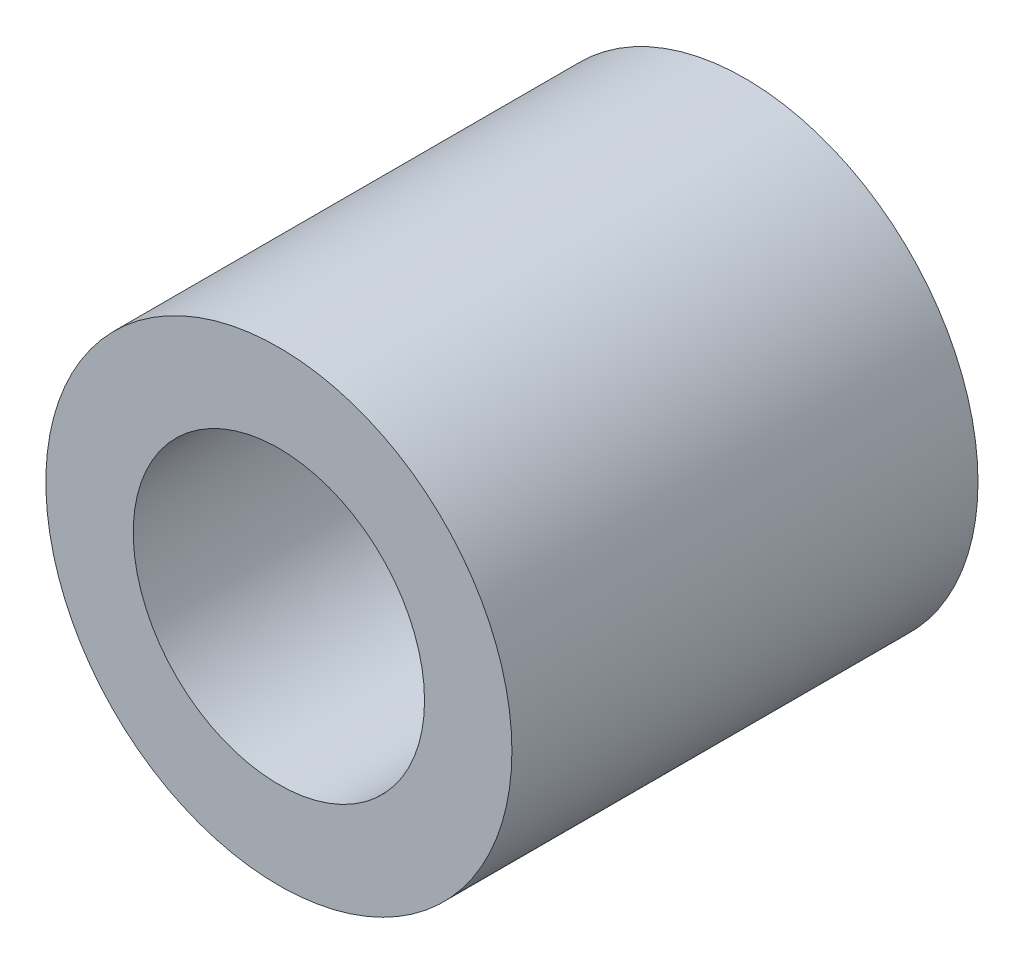
ISO-10303-21;
HEADER;
FILE_DESCRIPTION(('STEP AP214'),'2;1');
FILE_NAME('part.step','',(''),(''),'','','');
FILE_SCHEMA(('AUTOMOTIVE_DESIGN { 1 0 10303 214 1 1 1 1 }'));
ENDSEC;
DATA;
#1=APPLICATION_CONTEXT('core data for automotive mechanical design processes');
#2=APPLICATION_PROTOCOL_DEFINITION('international standard','automotive_design',2000,#1);
#3=PRODUCT_CONTEXT('',#1,'mechanical');
#4=PRODUCT('Part','Part','',(#3));
#5=PRODUCT_RELATED_PRODUCT_CATEGORY('part','',(#4));
#6=PRODUCT_DEFINITION_FORMATION('','',#4);
#7=PRODUCT_DEFINITION_CONTEXT('part definition',#1,'design');
#8=PRODUCT_DEFINITION('design','',#6,#7);
#9=PRODUCT_DEFINITION_SHAPE('','',#8);
#10=(LENGTH_UNIT() NAMED_UNIT(*) SI_UNIT(.MILLI.,.METRE.));
#11=(NAMED_UNIT(*) PLANE_ANGLE_UNIT() SI_UNIT($,.RADIAN.));
#12=(NAMED_UNIT(*) SI_UNIT($,.STERADIAN.) SOLID_ANGLE_UNIT());
#13=UNCERTAINTY_MEASURE_WITH_UNIT(LENGTH_MEASURE(1.E-05),#10,'distance_accuracy_value','');
#14=(GEOMETRIC_REPRESENTATION_CONTEXT(3) GLOBAL_UNCERTAINTY_ASSIGNED_CONTEXT((#13)) GLOBAL_UNIT_ASSIGNED_CONTEXT((#10,
#11,#12)) REPRESENTATION_CONTEXT('',''));
#15=CARTESIAN_POINT('',(0.,0.,0.));
#16=DIRECTION('',(0.,0.,1.));
#17=DIRECTION('',(1.,0.,0.));
#18=AXIS2_PLACEMENT_3D('',#15,#16,#17);
#19=CARTESIAN_POINT('',(0.,0.,8.));
#20=DIRECTION('',(0.,0.,-1.));
#21=DIRECTION('',(-1.,0.,0.));
#22=AXIS2_PLACEMENT_3D('',#19,#20,#21);
#23=CYLINDRICAL_SURFACE('',#22,5.);
#24=CARTESIAN_POINT('',(0.,0.,8.));
#25=DIRECTION('',(0.,0.,1.));
#26=DIRECTION('',(1.,0.,0.));
#27=AXIS2_PLACEMENT_3D('',#24,#25,#26);
#28=CIRCLE('',#27,5.);
#29=CARTESIAN_POINT('',(5.,0.,8.));
#30=VERTEX_POINT('',#29);
#31=EDGE_CURVE('E42',#30,#30,#28,.T.);
#32=ORIENTED_EDGE('',*,*,#31,.T.);
#33=EDGE_LOOP('',(#32));
#34=FACE_BOUND('',#33,.T.);
#35=CARTESIAN_POINT('',(0.,0.,-8.));
#36=DIRECTION('',(0.,0.,1.));
#37=DIRECTION('',(1.,0.,0.));
#38=AXIS2_PLACEMENT_3D('',#35,#36,#37);
#39=CIRCLE('',#38,5.);
#40=CARTESIAN_POINT('',(5.,0.,-8.));
#41=VERTEX_POINT('',#40);
#42=EDGE_CURVE('E48',#41,#41,#39,.T.);
#43=ORIENTED_EDGE('',*,*,#42,.F.);
#44=EDGE_LOOP('',(#43));
#45=FACE_BOUND('',#44,.T.);
#46=ADVANCED_FACE('F35',(#34,#45),#23,.F.);
#47=CARTESIAN_POINT('',(0.,0.,8.));
#48=DIRECTION('',(0.,0.,-1.));
#49=DIRECTION('',(-1.,0.,0.));
#50=AXIS2_PLACEMENT_3D('',#47,#48,#49);
#51=CYLINDRICAL_SURFACE('',#50,8.);
#52=CARTESIAN_POINT('',(0.,0.,8.));
#53=DIRECTION('',(0.,0.,1.));
#54=DIRECTION('',(1.,0.,0.));
#55=AXIS2_PLACEMENT_3D('',#52,#53,#54);
#56=CIRCLE('',#55,8.);
#57=CARTESIAN_POINT('',(8.,0.,8.));
#58=VERTEX_POINT('',#57);
#59=EDGE_CURVE('E10',#58,#58,#56,.T.);
#60=ORIENTED_EDGE('',*,*,#59,.F.);
#61=EDGE_LOOP('',(#60));
#62=FACE_BOUND('',#61,.T.);
#63=CARTESIAN_POINT('',(0.,0.,-8.));
#64=DIRECTION('',(0.,0.,1.));
#65=DIRECTION('',(1.,0.,0.));
#66=AXIS2_PLACEMENT_3D('',#63,#64,#65);
#67=CIRCLE('',#66,8.);
#68=CARTESIAN_POINT('',(8.,0.,-8.));
#69=VERTEX_POINT('',#68);
#70=EDGE_CURVE('E38',#69,#69,#67,.T.);
#71=ORIENTED_EDGE('',*,*,#70,.T.);
#72=EDGE_LOOP('',(#71));
#73=FACE_BOUND('',#72,.T.);
#74=ADVANCED_FACE('F55',(#62,#73),#51,.T.);
#75=CARTESIAN_POINT('',(0.,0.,8.));
#76=DIRECTION('',(0.,0.,1.));
#77=DIRECTION('',(1.,0.,0.));
#78=AXIS2_PLACEMENT_3D('',#75,#76,#77);
#79=PLANE('',#78);
#80=ORIENTED_EDGE('',*,*,#31,.F.);
#81=EDGE_LOOP('',(#80));
#82=FACE_BOUND('',#81,.T.);
#83=ORIENTED_EDGE('',*,*,#59,.T.);
#84=EDGE_LOOP('',(#83));
#85=FACE_BOUND('',#84,.T.);
#86=ADVANCED_FACE('F59',(#82,#85),#79,.T.);
#87=CARTESIAN_POINT('',(0.,0.,-8.));
#88=DIRECTION('',(0.,0.,1.));
#89=DIRECTION('',(1.,0.,0.));
#90=AXIS2_PLACEMENT_3D('',#87,#88,#89);
#91=PLANE('',#90);
#92=ORIENTED_EDGE('',*,*,#42,.T.);
#93=EDGE_LOOP('',(#92));
#94=FACE_BOUND('',#93,.T.);
#95=ORIENTED_EDGE('',*,*,#70,.F.);
#96=EDGE_LOOP('',(#95));
#97=FACE_BOUND('',#96,.T.);
#98=ADVANCED_FACE('F57',(#94,#97),#91,.F.);
#99=CLOSED_SHELL('',(#46,#74,#86,#98));
#100=MANIFOLD_SOLID_BREP('B2',#99);
#101=ADVANCED_BREP_SHAPE_REPRESENTATION('',(#18,#100),#14);
#102=SHAPE_DEFINITION_REPRESENTATION(#9,#101);
ENDSEC;
END-ISO-10303-21;
